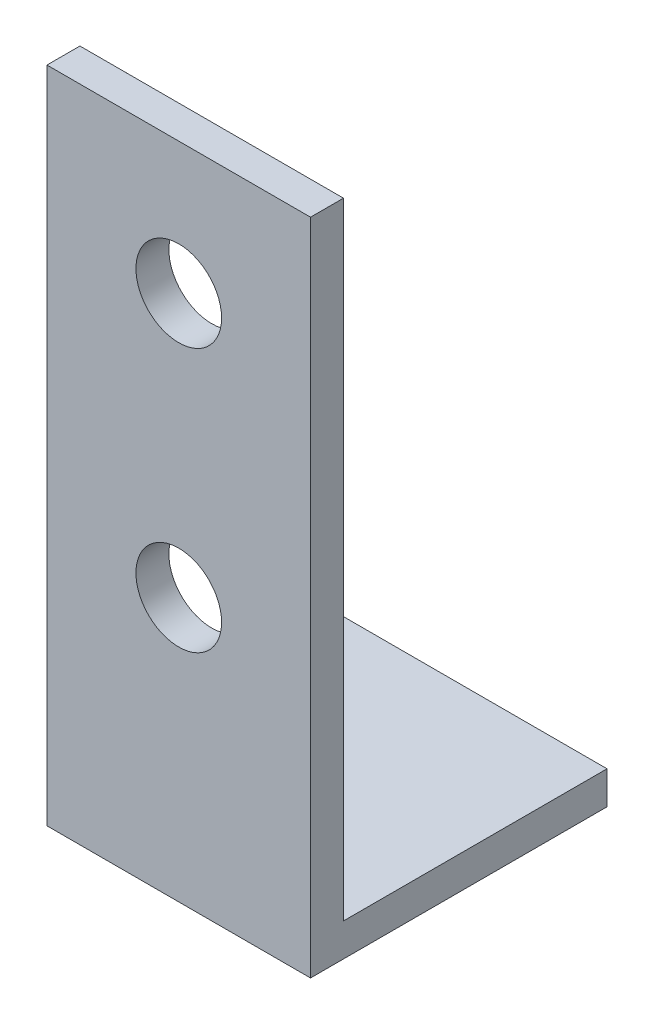
ISO-10303-21;
HEADER;
FILE_DESCRIPTION(('STEP AP214'),'2;1');
FILE_NAME('part.step','',(''),(''),'','','');
FILE_SCHEMA(('AUTOMOTIVE_DESIGN { 1 0 10303 214 1 1 1 1 }'));
ENDSEC;
DATA;
#1=APPLICATION_CONTEXT('core data for automotive mechanical design processes');
#2=APPLICATION_PROTOCOL_DEFINITION('international standard','automotive_design',2000,#1);
#3=PRODUCT_CONTEXT('',#1,'mechanical');
#4=PRODUCT('Part','Part','',(#3));
#5=PRODUCT_RELATED_PRODUCT_CATEGORY('part','',(#4));
#6=PRODUCT_DEFINITION_FORMATION('','',#4);
#7=PRODUCT_DEFINITION_CONTEXT('part definition',#1,'design');
#8=PRODUCT_DEFINITION('design','',#6,#7);
#9=PRODUCT_DEFINITION_SHAPE('','',#8);
#10=(LENGTH_UNIT() NAMED_UNIT(*) SI_UNIT(.MILLI.,.METRE.));
#11=(NAMED_UNIT(*) PLANE_ANGLE_UNIT() SI_UNIT($,.RADIAN.));
#12=(NAMED_UNIT(*) SI_UNIT($,.STERADIAN.) SOLID_ANGLE_UNIT());
#13=UNCERTAINTY_MEASURE_WITH_UNIT(LENGTH_MEASURE(1.E-05),#10,'distance_accuracy_value','');
#14=(GEOMETRIC_REPRESENTATION_CONTEXT(3) GLOBAL_UNCERTAINTY_ASSIGNED_CONTEXT((#13)) GLOBAL_UNIT_ASSIGNED_CONTEXT((#10,
#11,#12)) REPRESENTATION_CONTEXT('',''));
#15=CARTESIAN_POINT('',(0.,0.,0.));
#16=DIRECTION('',(0.,0.,1.));
#17=DIRECTION('',(1.,0.,0.));
#18=AXIS2_PLACEMENT_3D('',#15,#16,#17);
#19=CARTESIAN_POINT('',(8.,20.,0.));
#20=DIRECTION('',(0.,0.,-1.));
#21=DIRECTION('',(0.,1.,0.));
#22=AXIS2_PLACEMENT_3D('',#19,#20,#21);
#23=PLANE('',#22);
#24=CARTESIAN_POINT('',(4.,8.,0.));
#25=DIRECTION('',(0.,0.,1.));
#26=DIRECTION('',(1.,0.,0.));
#27=AXIS2_PLACEMENT_3D('',#24,#25,#26);
#28=CIRCLE('',#27,1.3);
#29=CARTESIAN_POINT('',(5.3,8.,0.));
#30=VERTEX_POINT('',#29);
#31=EDGE_CURVE('E144',#30,#30,#28,.T.);
#32=ORIENTED_EDGE('',*,*,#31,.F.);
#33=EDGE_LOOP('',(#32));
#34=FACE_BOUND('',#33,.T.);
#35=CARTESIAN_POINT('',(4.,16.,0.));
#36=DIRECTION('',(0.,0.,1.));
#37=DIRECTION('',(1.,0.,0.));
#38=AXIS2_PLACEMENT_3D('',#35,#36,#37);
#39=CIRCLE('',#38,1.3);
#40=CARTESIAN_POINT('',(5.3,16.,0.));
#41=VERTEX_POINT('',#40);
#42=EDGE_CURVE('E136',#41,#41,#39,.T.);
#43=ORIENTED_EDGE('',*,*,#42,.F.);
#44=EDGE_LOOP('',(#43));
#45=FACE_BOUND('',#44,.T.);
#46=DIRECTION('',(0.,-1.,0.));
#47=VECTOR('',#46,1.);
#48=CARTESIAN_POINT('',(0.,20.,0.));
#49=LINE('',#48,#47);
#50=CARTESIAN_POINT('',(0.,20.,0.));
#51=VERTEX_POINT('',#50);
#52=CARTESIAN_POINT('',(0.,0.,0.));
#53=VERTEX_POINT('',#52);
#54=EDGE_CURVE('E119',#51,#53,#49,.T.);
#55=ORIENTED_EDGE('',*,*,#54,.T.);
#56=DIRECTION('',(-1.,0.,0.));
#57=VECTOR('',#56,1.);
#58=CARTESIAN_POINT('',(8.,0.,0.));
#59=LINE('',#58,#57);
#60=CARTESIAN_POINT('',(8.,0.,0.));
#61=VERTEX_POINT('',#60);
#62=EDGE_CURVE('E11',#61,#53,#59,.T.);
#63=ORIENTED_EDGE('',*,*,#62,.F.);
#64=DIRECTION('',(0.,-1.,0.));
#65=VECTOR('',#64,1.);
#66=CARTESIAN_POINT('',(8.,20.,0.));
#67=LINE('',#66,#65);
#68=CARTESIAN_POINT('',(8.,20.,0.));
#69=VERTEX_POINT('',#68);
#70=EDGE_CURVE('E130',#69,#61,#67,.T.);
#71=ORIENTED_EDGE('',*,*,#70,.F.);
#72=DIRECTION('',(-1.,0.,0.));
#73=VECTOR('',#72,1.);
#74=CARTESIAN_POINT('',(8.,20.,0.));
#75=LINE('',#74,#73);
#76=EDGE_CURVE('E115',#69,#51,#75,.T.);
#77=ORIENTED_EDGE('',*,*,#76,.T.);
#78=EDGE_LOOP('',(#55,#63,#71,#77));
#79=FACE_BOUND('',#78,.T.);
#80=ADVANCED_FACE('F33',(#34,#45,#79),#23,.F.);
#81=CARTESIAN_POINT('',(8.,0.,0.));
#82=DIRECTION('',(0.,1.,0.));
#83=DIRECTION('',(0.,0.,1.));
#84=AXIS2_PLACEMENT_3D('',#81,#82,#83);
#85=PLANE('',#84);
#86=DIRECTION('',(0.,0.,-1.));
#87=VECTOR('',#86,1.);
#88=CARTESIAN_POINT('',(0.,0.,0.));
#89=LINE('',#88,#87);
#90=CARTESIAN_POINT('',(0.,0.,-9.));
#91=VERTEX_POINT('',#90);
#92=EDGE_CURVE('E122',#53,#91,#89,.T.);
#93=ORIENTED_EDGE('',*,*,#92,.T.);
#94=DIRECTION('',(-1.,0.,0.));
#95=VECTOR('',#94,1.);
#96=CARTESIAN_POINT('',(8.,0.,-9.));
#97=LINE('',#96,#95);
#98=CARTESIAN_POINT('',(8.,0.,-9.));
#99=VERTEX_POINT('',#98);
#100=EDGE_CURVE('E42',#99,#91,#97,.T.);
#101=ORIENTED_EDGE('',*,*,#100,.F.);
#102=DIRECTION('',(0.,0.,-1.));
#103=VECTOR('',#102,1.);
#104=CARTESIAN_POINT('',(8.,0.,0.));
#105=LINE('',#104,#103);
#106=EDGE_CURVE('E88',#61,#99,#105,.T.);
#107=ORIENTED_EDGE('',*,*,#106,.F.);
#108=ORIENTED_EDGE('',*,*,#62,.T.);
#109=EDGE_LOOP('',(#93,#101,#107,#108));
#110=FACE_BOUND('',#109,.T.);
#111=ADVANCED_FACE('F150',(#110),#85,.F.);
#112=CARTESIAN_POINT('',(8.,0.,-9.));
#113=DIRECTION('',(0.,0.,1.));
#114=DIRECTION('',(1.,0.,0.));
#115=AXIS2_PLACEMENT_3D('',#112,#113,#114);
#116=PLANE('',#115);
#117=DIRECTION('',(0.,1.,0.));
#118=VECTOR('',#117,1.);
#119=CARTESIAN_POINT('',(0.,0.,-9.));
#120=LINE('',#119,#118);
#121=CARTESIAN_POINT('',(0.,1.,-9.));
#122=VERTEX_POINT('',#121);
#123=EDGE_CURVE('E125',#91,#122,#120,.T.);
#124=ORIENTED_EDGE('',*,*,#123,.T.);
#125=DIRECTION('',(-1.,0.,0.));
#126=VECTOR('',#125,1.);
#127=CARTESIAN_POINT('',(8.,1.,-9.));
#128=LINE('',#127,#126);
#129=CARTESIAN_POINT('',(8.,1.,-9.));
#130=VERTEX_POINT('',#129);
#131=EDGE_CURVE('E110',#130,#122,#128,.T.);
#132=ORIENTED_EDGE('',*,*,#131,.F.);
#133=DIRECTION('',(0.,1.,0.));
#134=VECTOR('',#133,1.);
#135=CARTESIAN_POINT('',(8.,0.,-9.));
#136=LINE('',#135,#134);
#137=EDGE_CURVE('E101',#99,#130,#136,.T.);
#138=ORIENTED_EDGE('',*,*,#137,.F.);
#139=ORIENTED_EDGE('',*,*,#100,.T.);
#140=EDGE_LOOP('',(#124,#132,#138,#139));
#141=FACE_BOUND('',#140,.T.);
#142=ADVANCED_FACE('F153',(#141),#116,.F.);
#143=CARTESIAN_POINT('',(8.,1.,-9.));
#144=DIRECTION('',(0.,-1.,0.));
#145=DIRECTION('',(0.,0.,-1.));
#146=AXIS2_PLACEMENT_3D('',#143,#144,#145);
#147=PLANE('',#146);
#148=DIRECTION('',(0.,0.,1.));
#149=VECTOR('',#148,1.);
#150=CARTESIAN_POINT('',(0.,1.,-9.));
#151=LINE('',#150,#149);
#152=CARTESIAN_POINT('',(0.,0.999999999999999,-1.));
#153=VERTEX_POINT('',#152);
#154=EDGE_CURVE('E109',#122,#153,#151,.T.);
#155=ORIENTED_EDGE('',*,*,#154,.T.);
#156=DIRECTION('',(-1.,0.,0.));
#157=VECTOR('',#156,1.);
#158=CARTESIAN_POINT('',(8.,0.999999999999999,-1.));
#159=LINE('',#158,#157);
#160=CARTESIAN_POINT('',(8.,0.999999999999999,-1.));
#161=VERTEX_POINT('',#160);
#162=EDGE_CURVE('E106',#161,#153,#159,.T.);
#163=ORIENTED_EDGE('',*,*,#162,.F.);
#164=DIRECTION('',(0.,0.,1.));
#165=VECTOR('',#164,1.);
#166=CARTESIAN_POINT('',(8.,1.,-9.));
#167=LINE('',#166,#165);
#168=EDGE_CURVE('E95',#130,#161,#167,.T.);
#169=ORIENTED_EDGE('',*,*,#168,.F.);
#170=ORIENTED_EDGE('',*,*,#131,.T.);
#171=EDGE_LOOP('',(#155,#163,#169,#170));
#172=FACE_BOUND('',#171,.T.);
#173=ADVANCED_FACE('F107',(#172),#147,.F.);
#174=CARTESIAN_POINT('',(8.,0.999999999999999,-1.));
#175=DIRECTION('',(0.,0.,1.));
#176=DIRECTION('',(0.,-1.,0.));
#177=AXIS2_PLACEMENT_3D('',#174,#175,#176);
#178=PLANE('',#177);
#179=CARTESIAN_POINT('',(4.,8.,-0.999999999999999));
#180=DIRECTION('',(0.,0.,1.));
#181=DIRECTION('',(0.,-1.,0.));
#182=AXIS2_PLACEMENT_3D('',#179,#180,#181);
#183=CIRCLE('',#182,1.3);
#184=CARTESIAN_POINT('',(4.,6.7,-0.999999999999999));
#185=VERTEX_POINT('',#184);
#186=EDGE_CURVE('E36',#185,#185,#183,.T.);
#187=ORIENTED_EDGE('',*,*,#186,.T.);
#188=EDGE_LOOP('',(#187));
#189=FACE_BOUND('',#188,.T.);
#190=CARTESIAN_POINT('',(4.,16.,-0.999999999999999));
#191=DIRECTION('',(0.,0.,1.));
#192=DIRECTION('',(0.,-1.,0.));
#193=AXIS2_PLACEMENT_3D('',#190,#191,#192);
#194=CIRCLE('',#193,1.3);
#195=CARTESIAN_POINT('',(4.,14.7,-0.999999999999999));
#196=VERTEX_POINT('',#195);
#197=EDGE_CURVE('E123',#196,#196,#194,.T.);
#198=ORIENTED_EDGE('',*,*,#197,.T.);
#199=EDGE_LOOP('',(#198));
#200=FACE_BOUND('',#199,.T.);
#201=DIRECTION('',(0.,1.,0.));
#202=VECTOR('',#201,1.);
#203=CARTESIAN_POINT('',(0.,0.999999999999999,-1.));
#204=LINE('',#203,#202);
#205=CARTESIAN_POINT('',(0.,20.,-0.999999999999999));
#206=VERTEX_POINT('',#205);
#207=EDGE_CURVE('E74',#153,#206,#204,.T.);
#208=ORIENTED_EDGE('',*,*,#207,.T.);
#209=DIRECTION('',(-1.,0.,0.));
#210=VECTOR('',#209,1.);
#211=CARTESIAN_POINT('',(8.,20.,-0.999999999999999));
#212=LINE('',#211,#210);
#213=CARTESIAN_POINT('',(8.,20.,-0.999999999999999));
#214=VERTEX_POINT('',#213);
#215=EDGE_CURVE('E111',#214,#206,#212,.T.);
#216=ORIENTED_EDGE('',*,*,#215,.F.);
#217=DIRECTION('',(0.,1.,0.));
#218=VECTOR('',#217,1.);
#219=CARTESIAN_POINT('',(8.,0.999999999999999,-1.));
#220=LINE('',#219,#218);
#221=EDGE_CURVE('E99',#161,#214,#220,.T.);
#222=ORIENTED_EDGE('',*,*,#221,.F.);
#223=ORIENTED_EDGE('',*,*,#162,.T.);
#224=EDGE_LOOP('',(#208,#216,#222,#223));
#225=FACE_BOUND('',#224,.T.);
#226=ADVANCED_FACE('F113',(#189,#200,#225),#178,.F.);
#227=CARTESIAN_POINT('',(8.,20.,-0.999999999999999));
#228=DIRECTION('',(0.,-1.,0.));
#229=DIRECTION('',(0.,0.,-1.));
#230=AXIS2_PLACEMENT_3D('',#227,#228,#229);
#231=PLANE('',#230);
#232=DIRECTION('',(0.,0.,1.));
#233=VECTOR('',#232,1.);
#234=CARTESIAN_POINT('',(0.,20.,-0.999999999999999));
#235=LINE('',#234,#233);
#236=EDGE_CURVE('E80',#206,#51,#235,.T.);
#237=ORIENTED_EDGE('',*,*,#236,.T.);
#238=ORIENTED_EDGE('',*,*,#76,.F.);
#239=DIRECTION('',(0.,0.,1.));
#240=VECTOR('',#239,1.);
#241=CARTESIAN_POINT('',(8.,20.,-0.999999999999999));
#242=LINE('',#241,#240);
#243=EDGE_CURVE('E51',#214,#69,#242,.T.);
#244=ORIENTED_EDGE('',*,*,#243,.F.);
#245=ORIENTED_EDGE('',*,*,#215,.T.);
#246=EDGE_LOOP('',(#237,#238,#244,#245));
#247=FACE_BOUND('',#246,.T.);
#248=ADVANCED_FACE('F158',(#247),#231,.F.);
#249=CARTESIAN_POINT('',(8.,0.,0.));
#250=DIRECTION('',(1.,0.,0.));
#251=DIRECTION('',(0.,0.,-1.));
#252=AXIS2_PLACEMENT_3D('',#249,#250,#251);
#253=PLANE('',#252);
#254=ORIENTED_EDGE('',*,*,#70,.T.);
#255=ORIENTED_EDGE('',*,*,#106,.T.);
#256=ORIENTED_EDGE('',*,*,#137,.T.);
#257=ORIENTED_EDGE('',*,*,#168,.T.);
#258=ORIENTED_EDGE('',*,*,#221,.T.);
#259=ORIENTED_EDGE('',*,*,#243,.T.);
#260=EDGE_LOOP('',(#254,#255,#256,#257,#258,#259));
#261=FACE_BOUND('',#260,.T.);
#262=ADVANCED_FACE('F97',(#261),#253,.T.);
#263=CARTESIAN_POINT('',(0.,0.,0.));
#264=DIRECTION('',(1.,0.,0.));
#265=DIRECTION('',(0.,0.,-1.));
#266=AXIS2_PLACEMENT_3D('',#263,#264,#265);
#267=PLANE('',#266);
#268=ORIENTED_EDGE('',*,*,#54,.F.);
#269=ORIENTED_EDGE('',*,*,#236,.F.);
#270=ORIENTED_EDGE('',*,*,#207,.F.);
#271=ORIENTED_EDGE('',*,*,#154,.F.);
#272=ORIENTED_EDGE('',*,*,#123,.F.);
#273=ORIENTED_EDGE('',*,*,#92,.F.);
#274=EDGE_LOOP('',(#268,#269,#270,#271,#272,#273));
#275=FACE_BOUND('',#274,.T.);
#276=ADVANCED_FACE('F156',(#275),#267,.F.);
#277=CARTESIAN_POINT('',(4.,16.,-9.));
#278=DIRECTION('',(0.,0.,1.));
#279=DIRECTION('',(1.,0.,0.));
#280=AXIS2_PLACEMENT_3D('',#277,#278,#279);
#281=CYLINDRICAL_SURFACE('',#280,1.3);
#282=ORIENTED_EDGE('',*,*,#42,.T.);
#283=EDGE_LOOP('',(#282));
#284=FACE_BOUND('',#283,.T.);
#285=ORIENTED_EDGE('',*,*,#197,.F.);
#286=EDGE_LOOP('',(#285));
#287=FACE_BOUND('',#286,.T.);
#288=ADVANCED_FACE('F181',(#284,#287),#281,.F.);
#289=CARTESIAN_POINT('',(4.,8.,-9.));
#290=DIRECTION('',(0.,0.,1.));
#291=DIRECTION('',(1.,0.,0.));
#292=AXIS2_PLACEMENT_3D('',#289,#290,#291);
#293=CYLINDRICAL_SURFACE('',#292,1.3);
#294=ORIENTED_EDGE('',*,*,#31,.T.);
#295=EDGE_LOOP('',(#294));
#296=FACE_BOUND('',#295,.T.);
#297=ORIENTED_EDGE('',*,*,#186,.F.);
#298=EDGE_LOOP('',(#297));
#299=FACE_BOUND('',#298,.T.);
#300=ADVANCED_FACE('F178',(#296,#299),#293,.F.);
#301=CLOSED_SHELL('',(#80,#111,#142,#173,#226,#248,#262,#276,#288,#300));
#302=MANIFOLD_SOLID_BREP('B2',#301);
#303=ADVANCED_BREP_SHAPE_REPRESENTATION('',(#18,#302),#14);
#304=SHAPE_DEFINITION_REPRESENTATION(#9,#303);
ENDSEC;
END-ISO-10303-21;
